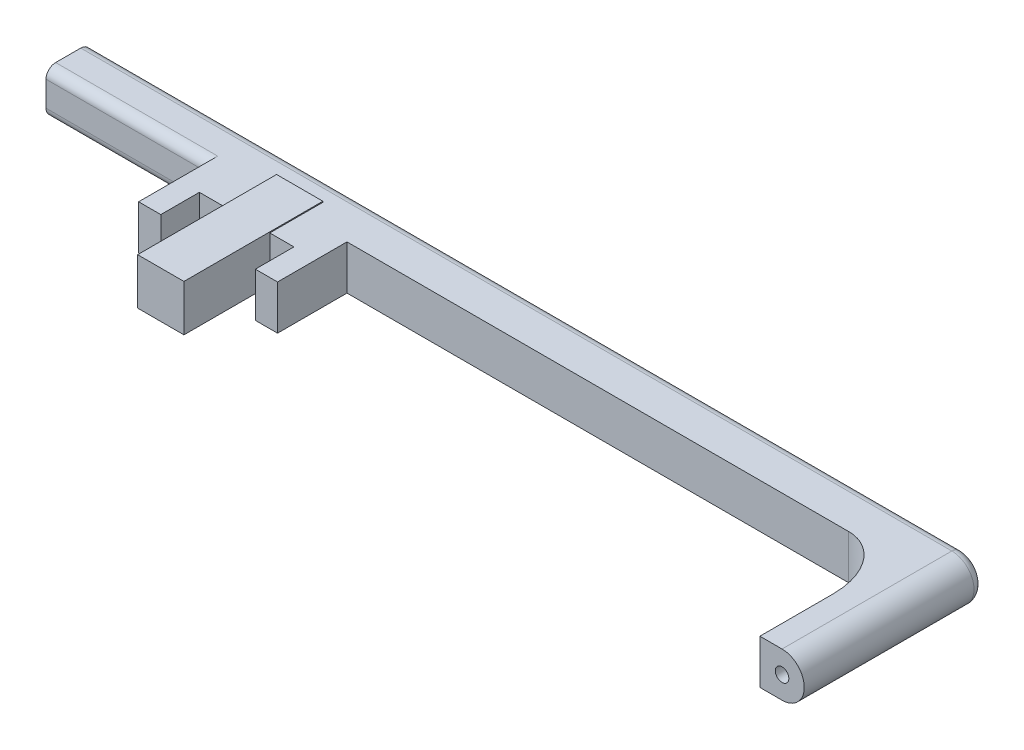
ISO-10303-21;
HEADER;
FILE_DESCRIPTION(('STEP AP214'),'2;1');
FILE_NAME('part.step','',(''),(''),'','','');
FILE_SCHEMA(('AUTOMOTIVE_DESIGN { 1 0 10303 214 1 1 1 1 }'));
ENDSEC;
DATA;
#1=APPLICATION_CONTEXT('core data for automotive mechanical design processes');
#2=APPLICATION_PROTOCOL_DEFINITION('international standard','automotive_design',2000,#1);
#3=PRODUCT_CONTEXT('',#1,'mechanical');
#4=PRODUCT('Part','Part','',(#3));
#5=PRODUCT_RELATED_PRODUCT_CATEGORY('part','',(#4));
#6=PRODUCT_DEFINITION_FORMATION('','',#4);
#7=PRODUCT_DEFINITION_CONTEXT('part definition',#1,'design');
#8=PRODUCT_DEFINITION('design','',#6,#7);
#9=PRODUCT_DEFINITION_SHAPE('','',#8);
#10=(LENGTH_UNIT() NAMED_UNIT(*) SI_UNIT(.MILLI.,.METRE.));
#11=(NAMED_UNIT(*) PLANE_ANGLE_UNIT() SI_UNIT($,.RADIAN.));
#12=(NAMED_UNIT(*) SI_UNIT($,.STERADIAN.) SOLID_ANGLE_UNIT());
#13=UNCERTAINTY_MEASURE_WITH_UNIT(LENGTH_MEASURE(1.E-05),#10,'distance_accuracy_value','');
#14=(GEOMETRIC_REPRESENTATION_CONTEXT(3) GLOBAL_UNCERTAINTY_ASSIGNED_CONTEXT((#13)) GLOBAL_UNIT_ASSIGNED_CONTEXT((#10,
#11,#12)) REPRESENTATION_CONTEXT('',''));
#15=CARTESIAN_POINT('',(0.,0.,0.));
#16=DIRECTION('',(0.,0.,1.));
#17=DIRECTION('',(1.,0.,0.));
#18=AXIS2_PLACEMENT_3D('',#15,#16,#17);
#19=CARTESIAN_POINT('',(1.2,-1.2,7.2));
#20=DIRECTION('',(-1.,0.,0.));
#21=DIRECTION('',(0.,0.,1.));
#22=AXIS2_PLACEMENT_3D('',#19,#20,#21);
#23=PLANE('',#22);
#24=DIRECTION('',(0.,-1.,0.));
#25=VECTOR('',#24,1.);
#26=CARTESIAN_POINT('',(1.2,-1.2,2.75));
#27=LINE('',#26,#25);
#28=CARTESIAN_POINT('',(1.2,1.15,2.75));
#29=VERTEX_POINT('',#28);
#30=CARTESIAN_POINT('',(1.2,-1.15,2.75));
#31=VERTEX_POINT('',#30);
#32=EDGE_CURVE('E527',#29,#31,#27,.T.);
#33=ORIENTED_EDGE('',*,*,#32,.F.);
#34=DIRECTION('',(0.,0.,-1.));
#35=VECTOR('',#34,1.);
#36=CARTESIAN_POINT('',(1.2,1.15,7.2));
#37=LINE('',#36,#35);
#38=CARTESIAN_POINT('',(1.2,1.15,0.));
#39=VERTEX_POINT('',#38);
#40=EDGE_CURVE('E249',#29,#39,#37,.T.);
#41=ORIENTED_EDGE('',*,*,#40,.T.);
#42=DIRECTION('',(0.,1.,0.));
#43=VECTOR('',#42,1.);
#44=CARTESIAN_POINT('',(1.2,-1.2,0.));
#45=LINE('',#44,#43);
#46=CARTESIAN_POINT('',(1.2,1.2,0.));
#47=VERTEX_POINT('',#46);
#48=EDGE_CURVE('E502',#39,#47,#45,.T.);
#49=ORIENTED_EDGE('',*,*,#48,.T.);
#50=DIRECTION('',(0.,0.,-1.));
#51=VECTOR('',#50,1.);
#52=CARTESIAN_POINT('',(1.2,1.2,7.2));
#53=LINE('',#52,#51);
#54=CARTESIAN_POINT('',(1.2,1.2,7.2));
#55=VERTEX_POINT('',#54);
#56=EDGE_CURVE('E477',#55,#47,#53,.T.);
#57=ORIENTED_EDGE('',*,*,#56,.F.);
#58=DIRECTION('',(0.,1.,0.));
#59=VECTOR('',#58,1.);
#60=CARTESIAN_POINT('',(1.2,-1.2,7.2));
#61=LINE('',#60,#59);
#62=CARTESIAN_POINT('',(1.2,-1.2,7.2));
#63=VERTEX_POINT('',#62);
#64=EDGE_CURVE('E493',#63,#55,#61,.T.);
#65=ORIENTED_EDGE('',*,*,#64,.F.);
#66=DIRECTION('',(0.,0.,-1.));
#67=VECTOR('',#66,1.);
#68=CARTESIAN_POINT('',(1.2,-1.2,7.2));
#69=LINE('',#68,#67);
#70=CARTESIAN_POINT('',(1.2,-1.2,0.));
#71=VERTEX_POINT('',#70);
#72=EDGE_CURVE('E487',#63,#71,#69,.T.);
#73=ORIENTED_EDGE('',*,*,#72,.T.);
#74=CARTESIAN_POINT('',(1.2,-1.15,0.));
#75=VERTEX_POINT('',#74);
#76=EDGE_CURVE('E499',#71,#75,#45,.T.);
#77=ORIENTED_EDGE('',*,*,#76,.T.);
#78=DIRECTION('',(0.,0.,1.));
#79=VECTOR('',#78,1.);
#80=CARTESIAN_POINT('',(1.2,-1.15,7.2));
#81=LINE('',#80,#79);
#82=EDGE_CURVE('E510',#75,#31,#81,.T.);
#83=ORIENTED_EDGE('',*,*,#82,.T.);
#84=EDGE_LOOP('',(#33,#41,#49,#57,#65,#73,#77,#83));
#85=FACE_BOUND('',#84,.T.);
#86=ADVANCED_FACE('F43',(#85),#23,.F.);
#87=CARTESIAN_POINT('',(-1.2,-1.2,7.2));
#88=DIRECTION('',(1.,0.,0.));
#89=DIRECTION('',(0.,0.,-1.));
#90=AXIS2_PLACEMENT_3D('',#87,#88,#89);
#91=PLANE('',#90);
#92=DIRECTION('',(0.,0.,1.));
#93=VECTOR('',#92,1.);
#94=CARTESIAN_POINT('',(-1.2,1.15,7.2));
#95=LINE('',#94,#93);
#96=CARTESIAN_POINT('',(-1.2,1.15,0.));
#97=VERTEX_POINT('',#96);
#98=CARTESIAN_POINT('',(-1.2,1.15,2.75));
#99=VERTEX_POINT('',#98);
#100=EDGE_CURVE('E61',#97,#99,#95,.T.);
#101=ORIENTED_EDGE('',*,*,#100,.T.);
#102=DIRECTION('',(0.,1.,0.));
#103=VECTOR('',#102,1.);
#104=CARTESIAN_POINT('',(-1.2,-1.2,2.75));
#105=LINE('',#104,#103);
#106=CARTESIAN_POINT('',(-1.2,-1.15,2.75));
#107=VERTEX_POINT('',#106);
#108=EDGE_CURVE('E529',#107,#99,#105,.T.);
#109=ORIENTED_EDGE('',*,*,#108,.F.);
#110=DIRECTION('',(0.,0.,-1.));
#111=VECTOR('',#110,1.);
#112=CARTESIAN_POINT('',(-1.2,-1.15,7.2));
#113=LINE('',#112,#111);
#114=CARTESIAN_POINT('',(-1.2,-1.15,0.));
#115=VERTEX_POINT('',#114);
#116=EDGE_CURVE('E69',#107,#115,#113,.T.);
#117=ORIENTED_EDGE('',*,*,#116,.T.);
#118=DIRECTION('',(0.,-1.,0.));
#119=VECTOR('',#118,1.);
#120=CARTESIAN_POINT('',(-1.2,-1.2,0.));
#121=LINE('',#120,#119);
#122=CARTESIAN_POINT('',(-1.2,-1.2,0.));
#123=VERTEX_POINT('',#122);
#124=EDGE_CURVE('E496',#115,#123,#121,.T.);
#125=ORIENTED_EDGE('',*,*,#124,.T.);
#126=DIRECTION('',(0.,0.,-1.));
#127=VECTOR('',#126,1.);
#128=CARTESIAN_POINT('',(-1.2,-1.2,7.2));
#129=LINE('',#128,#127);
#130=CARTESIAN_POINT('',(-1.2,-1.2,7.2));
#131=VERTEX_POINT('',#130);
#132=EDGE_CURVE('E484',#131,#123,#129,.T.);
#133=ORIENTED_EDGE('',*,*,#132,.F.);
#134=DIRECTION('',(0.,-1.,0.));
#135=VECTOR('',#134,1.);
#136=CARTESIAN_POINT('',(-1.2,-1.2,7.2));
#137=LINE('',#136,#135);
#138=CARTESIAN_POINT('',(-1.2,1.2,7.2));
#139=VERTEX_POINT('',#138);
#140=EDGE_CURVE('E504',#139,#131,#137,.T.);
#141=ORIENTED_EDGE('',*,*,#140,.F.);
#142=DIRECTION('',(0.,0.,-1.));
#143=VECTOR('',#142,1.);
#144=CARTESIAN_POINT('',(-1.2,1.2,7.2));
#145=LINE('',#144,#143);
#146=CARTESIAN_POINT('',(-1.2,1.2,0.));
#147=VERTEX_POINT('',#146);
#148=EDGE_CURVE('E479',#139,#147,#145,.T.);
#149=ORIENTED_EDGE('',*,*,#148,.T.);
#150=EDGE_CURVE('E494',#147,#97,#121,.T.);
#151=ORIENTED_EDGE('',*,*,#150,.T.);
#152=EDGE_LOOP('',(#101,#109,#117,#125,#133,#141,#149,#151));
#153=FACE_BOUND('',#152,.T.);
#154=ADVANCED_FACE('F605',(#153),#91,.F.);
#155=CARTESIAN_POINT('',(-2.45,0.,-0.65));
#156=DIRECTION('',(-1.,0.,0.));
#157=DIRECTION('',(0.,-1.,0.));
#158=AXIS2_PLACEMENT_3D('',#155,#156,#157);
#159=PLANE('',#158);
#160=DIRECTION('',(0.,-1.,0.));
#161=VECTOR('',#160,1.);
#162=CARTESIAN_POINT('',(-2.45,0.,2.75));
#163=LINE('',#162,#161);
#164=CARTESIAN_POINT('',(-2.45,1.15,2.75));
#165=VERTEX_POINT('',#164);
#166=CARTESIAN_POINT('',(-2.45,-1.15,2.75));
#167=VERTEX_POINT('',#166);
#168=EDGE_CURVE('E238',#165,#167,#163,.T.);
#169=ORIENTED_EDGE('',*,*,#168,.F.);
#170=DIRECTION('',(0.,0.,1.));
#171=VECTOR('',#170,1.);
#172=CARTESIAN_POINT('',(-2.45,1.15,-0.65));
#173=LINE('',#172,#171);
#174=CARTESIAN_POINT('',(-2.45,1.15,4.75));
#175=VERTEX_POINT('',#174);
#176=EDGE_CURVE('E284',#165,#175,#173,.T.);
#177=ORIENTED_EDGE('',*,*,#176,.T.);
#178=DIRECTION('',(0.,-1.,0.));
#179=VECTOR('',#178,1.);
#180=CARTESIAN_POINT('',(-2.45,0.,4.75));
#181=LINE('',#180,#179);
#182=CARTESIAN_POINT('',(-2.45,-1.15,4.75));
#183=VERTEX_POINT('',#182);
#184=EDGE_CURVE('E280',#175,#183,#181,.T.);
#185=ORIENTED_EDGE('',*,*,#184,.T.);
#186=DIRECTION('',(0.,0.,1.));
#187=VECTOR('',#186,1.);
#188=CARTESIAN_POINT('',(-2.45,-1.15,-0.65));
#189=LINE('',#188,#187);
#190=EDGE_CURVE('E287',#167,#183,#189,.T.);
#191=ORIENTED_EDGE('',*,*,#190,.F.);
#192=EDGE_LOOP('',(#169,#177,#185,#191));
#193=FACE_BOUND('',#192,.T.);
#194=ADVANCED_FACE('F541',(#193),#159,.F.);
#195=CARTESIAN_POINT('',(2.45,0.,4.75));
#196=DIRECTION('',(-1.,0.,0.));
#197=DIRECTION('',(0.,0.,1.));
#198=AXIS2_PLACEMENT_3D('',#195,#196,#197);
#199=PLANE('',#198);
#200=DIRECTION('',(0.,0.,-1.));
#201=VECTOR('',#200,1.);
#202=CARTESIAN_POINT('',(2.45,1.15,4.75));
#203=LINE('',#202,#201);
#204=CARTESIAN_POINT('',(2.45,1.15,4.75));
#205=VERTEX_POINT('',#204);
#206=CARTESIAN_POINT('',(2.45,1.15,2.75));
#207=VERTEX_POINT('',#206);
#208=EDGE_CURVE('E245',#205,#207,#203,.T.);
#209=ORIENTED_EDGE('',*,*,#208,.T.);
#210=DIRECTION('',(0.,-1.,0.));
#211=VECTOR('',#210,1.);
#212=CARTESIAN_POINT('',(2.45,0.,2.75));
#213=LINE('',#212,#211);
#214=CARTESIAN_POINT('',(2.45,-1.15,2.75));
#215=VERTEX_POINT('',#214);
#216=EDGE_CURVE('E227',#207,#215,#213,.T.);
#217=ORIENTED_EDGE('',*,*,#216,.T.);
#218=DIRECTION('',(0.,0.,-1.));
#219=VECTOR('',#218,1.);
#220=CARTESIAN_POINT('',(2.45,-1.15,4.75));
#221=LINE('',#220,#219);
#222=CARTESIAN_POINT('',(2.45,-1.15,4.75));
#223=VERTEX_POINT('',#222);
#224=EDGE_CURVE('E266',#223,#215,#221,.T.);
#225=ORIENTED_EDGE('',*,*,#224,.F.);
#226=DIRECTION('',(0.,1.,0.));
#227=VECTOR('',#226,1.);
#228=CARTESIAN_POINT('',(2.45,0.,4.75));
#229=LINE('',#228,#227);
#230=EDGE_CURVE('E254',#223,#205,#229,.T.);
#231=ORIENTED_EDGE('',*,*,#230,.T.);
#232=EDGE_LOOP('',(#209,#217,#225,#231));
#233=FACE_BOUND('',#232,.T.);
#234=ADVANCED_FACE('F252',(#233),#199,.T.);
#235=CARTESIAN_POINT('',(0.,0.,0.));
#236=DIRECTION('',(0.,0.,-1.));
#237=DIRECTION('',(-1.,0.,0.));
#238=AXIS2_PLACEMENT_3D('',#235,#236,#237);
#239=PLANE('',#238);
#240=DIRECTION('',(-1.,0.,0.));
#241=VECTOR('',#240,1.);
#242=CARTESIAN_POINT('',(0.,-1.15,0.));
#243=LINE('',#242,#241);
#244=EDGE_CURVE('E330',#75,#115,#243,.T.);
#245=ORIENTED_EDGE('',*,*,#244,.F.);
#246=ORIENTED_EDGE('',*,*,#76,.F.);
#247=DIRECTION('',(1.,0.,0.));
#248=VECTOR('',#247,1.);
#249=CARTESIAN_POINT('',(-1.2,-1.2,0.));
#250=LINE('',#249,#248);
#251=EDGE_CURVE('E491',#123,#71,#250,.T.);
#252=ORIENTED_EDGE('',*,*,#251,.F.);
#253=ORIENTED_EDGE('',*,*,#124,.F.);
#254=EDGE_LOOP('',(#245,#246,#252,#253));
#255=FACE_BOUND('',#254,.T.);
#256=ADVANCED_FACE('F615',(#255),#239,.T.);
#257=CARTESIAN_POINT('',(-1.2,1.2,7.2));
#258=DIRECTION('',(0.,-1.,0.));
#259=DIRECTION('',(0.,0.,-1.));
#260=AXIS2_PLACEMENT_3D('',#257,#258,#259);
#261=PLANE('',#260);
#262=DIRECTION('',(-1.,0.,0.));
#263=VECTOR('',#262,1.);
#264=CARTESIAN_POINT('',(-1.2,1.2,0.));
#265=LINE('',#264,#263);
#266=EDGE_CURVE('E497',#47,#147,#265,.T.);
#267=ORIENTED_EDGE('',*,*,#266,.T.);
#268=ORIENTED_EDGE('',*,*,#148,.F.);
#269=DIRECTION('',(-1.,0.,0.));
#270=VECTOR('',#269,1.);
#271=CARTESIAN_POINT('',(-1.2,1.2,7.2));
#272=LINE('',#271,#270);
#273=EDGE_CURVE('E506',#55,#139,#272,.T.);
#274=ORIENTED_EDGE('',*,*,#273,.F.);
#275=ORIENTED_EDGE('',*,*,#56,.T.);
#276=EDGE_LOOP('',(#267,#268,#274,#275));
#277=FACE_BOUND('',#276,.T.);
#278=ADVANCED_FACE('F631',(#277),#261,.F.);
#279=CARTESIAN_POINT('',(-1.2,-1.2,7.2));
#280=DIRECTION('',(0.,1.,0.));
#281=DIRECTION('',(0.,0.,1.));
#282=AXIS2_PLACEMENT_3D('',#279,#280,#281);
#283=PLANE('',#282);
#284=ORIENTED_EDGE('',*,*,#251,.T.);
#285=ORIENTED_EDGE('',*,*,#72,.F.);
#286=DIRECTION('',(1.,0.,0.));
#287=VECTOR('',#286,1.);
#288=CARTESIAN_POINT('',(-1.2,-1.2,7.2));
#289=LINE('',#288,#287);
#290=EDGE_CURVE('E490',#131,#63,#289,.T.);
#291=ORIENTED_EDGE('',*,*,#290,.F.);
#292=ORIENTED_EDGE('',*,*,#132,.T.);
#293=EDGE_LOOP('',(#284,#285,#291,#292));
#294=FACE_BOUND('',#293,.T.);
#295=ADVANCED_FACE('F621',(#294),#283,.F.);
#296=CARTESIAN_POINT('',(0.,0.,7.2));
#297=DIRECTION('',(0.,0.,-1.));
#298=DIRECTION('',(-1.,0.,0.));
#299=AXIS2_PLACEMENT_3D('',#296,#297,#298);
#300=PLANE('',#299);
#301=ORIENTED_EDGE('',*,*,#64,.T.);
#302=ORIENTED_EDGE('',*,*,#273,.T.);
#303=ORIENTED_EDGE('',*,*,#140,.T.);
#304=ORIENTED_EDGE('',*,*,#290,.T.);
#305=EDGE_LOOP('',(#301,#302,#303,#304));
#306=FACE_BOUND('',#305,.T.);
#307=ADVANCED_FACE('F623',(#306),#300,.F.);
#308=DIRECTION('',(1.,0.,0.));
#309=VECTOR('',#308,1.);
#310=CARTESIAN_POINT('',(0.,1.15,0.));
#311=LINE('',#310,#309);
#312=EDGE_CURVE('E475',#97,#39,#311,.T.);
#313=ORIENTED_EDGE('',*,*,#312,.F.);
#314=ORIENTED_EDGE('',*,*,#150,.F.);
#315=ORIENTED_EDGE('',*,*,#266,.F.);
#316=ORIENTED_EDGE('',*,*,#48,.F.);
#317=EDGE_LOOP('',(#313,#314,#315,#316));
#318=FACE_BOUND('',#317,.T.);
#319=ADVANCED_FACE('F630',(#318),#239,.T.);
#320=CARTESIAN_POINT('',(-12.,-1.15,1.15));
#321=DIRECTION('',(0.,0.,1.));
#322=DIRECTION('',(1.,0.,0.));
#323=AXIS2_PLACEMENT_3D('',#320,#321,#322);
#324=PLANE('',#323);
#325=DIRECTION('',(0.,1.,0.));
#326=VECTOR('',#325,1.);
#327=CARTESIAN_POINT('',(3.6,-1.15,1.15));
#328=LINE('',#327,#326);
#329=CARTESIAN_POINT('',(3.6,-1.15,1.15));
#330=VERTEX_POINT('',#329);
#331=CARTESIAN_POINT('',(3.6,1.15,1.15));
#332=VERTEX_POINT('',#331);
#333=EDGE_CURVE('E268',#330,#332,#328,.T.);
#334=ORIENTED_EDGE('',*,*,#333,.F.);
#335=DIRECTION('',(1.,0.,0.));
#336=VECTOR('',#335,1.);
#337=CARTESIAN_POINT('',(-12.,-1.15,1.15));
#338=LINE('',#337,#336);
#339=CARTESIAN_POINT('',(29.6,-1.15,1.15));
#340=VERTEX_POINT('',#339);
#341=EDGE_CURVE('E47',#330,#340,#338,.T.);
#342=ORIENTED_EDGE('',*,*,#341,.T.);
#343=CARTESIAN_POINT('',(29.6,1.265,1.15));
#344=CARTESIAN_POINT('',(29.6,0.421666666666668,1.15));
#345=CARTESIAN_POINT('',(29.6,-0.421666666666668,1.15));
#346=CARTESIAN_POINT('',(29.6,-1.265,1.15));
#347=(BOUNDED_CURVE() B_SPLINE_CURVE(3,(#343,#344,#345,#346),.UNSPECIFIED.,.F.,
.F.) B_SPLINE_CURVE_WITH_KNOTS((4,4),(-0.001265,0.001265),
.UNSPECIFIED.) CURVE() GEOMETRIC_REPRESENTATION_ITEM() RATIONAL_B_SPLINE_CURVE((1.,1.,1.,1.)) REPRESENTATION_ITEM(''));
#348=CARTESIAN_POINT('',(29.6,1.15,1.15));
#349=VERTEX_POINT('',#348);
#350=EDGE_CURVE('E462',#340,#349,#347,.F.);
#351=ORIENTED_EDGE('',*,*,#350,.T.);
#352=DIRECTION('',(1.,0.,0.));
#353=VECTOR('',#352,1.);
#354=CARTESIAN_POINT('',(-12.,1.15,1.15));
#355=LINE('',#354,#353);
#356=EDGE_CURVE('E352',#332,#349,#355,.T.);
#357=ORIENTED_EDGE('',*,*,#356,.F.);
#358=EDGE_LOOP('',(#334,#342,#351,#357));
#359=FACE_BOUND('',#358,.T.);
#360=ADVANCED_FACE('F514',(#359),#324,.T.);
#361=DIRECTION('',(0.,-1.,0.));
#362=VECTOR('',#361,1.);
#363=CARTESIAN_POINT('',(-3.6,-1.15,1.15));
#364=LINE('',#363,#362);
#365=CARTESIAN_POINT('',(-3.6,0.65,1.15));
#366=VERTEX_POINT('',#365);
#367=CARTESIAN_POINT('',(-3.6,-0.65,1.15));
#368=VERTEX_POINT('',#367);
#369=EDGE_CURVE('E286',#366,#368,#364,.T.);
#370=ORIENTED_EDGE('',*,*,#369,.F.);
#371=DIRECTION('',(1.,0.,0.));
#372=VECTOR('',#371,1.);
#373=CARTESIAN_POINT('',(-12.,0.65,1.15));
#374=LINE('',#373,#372);
#375=CARTESIAN_POINT('',(-12.,0.65,1.15));
#376=VERTEX_POINT('',#375);
#377=EDGE_CURVE('E370',#366,#376,#374,.F.);
#378=ORIENTED_EDGE('',*,*,#377,.T.);
#379=DIRECTION('',(0.,-1.,0.));
#380=VECTOR('',#379,1.);
#381=CARTESIAN_POINT('',(-12.,-1.15,1.15));
#382=LINE('',#381,#380);
#383=CARTESIAN_POINT('',(-12.,-0.65,1.15));
#384=VERTEX_POINT('',#383);
#385=EDGE_CURVE('E347',#376,#384,#382,.T.);
#386=ORIENTED_EDGE('',*,*,#385,.T.);
#387=DIRECTION('',(1.,0.,0.));
#388=VECTOR('',#387,1.);
#389=CARTESIAN_POINT('',(-12.,-0.65,1.15));
#390=LINE('',#389,#388);
#391=EDGE_CURVE('E367',#384,#368,#390,.T.);
#392=ORIENTED_EDGE('',*,*,#391,.T.);
#393=EDGE_LOOP('',(#370,#378,#386,#392));
#394=FACE_BOUND('',#393,.T.);
#395=ADVANCED_FACE('F563',(#394),#324,.T.);
#396=CARTESIAN_POINT('',(-12.,-1.15,1.15));
#397=DIRECTION('',(0.,-1.,0.));
#398=DIRECTION('',(0.,0.,-1.));
#399=AXIS2_PLACEMENT_3D('',#396,#397,#398);
#400=PLANE('',#399);
#401=DIRECTION('',(1.,0.,0.));
#402=VECTOR('',#401,1.);
#403=CARTESIAN_POINT('',(-12.,-1.15,-0.65));
#404=LINE('',#403,#402);
#405=CARTESIAN_POINT('',(-12.,-1.15,-0.65));
#406=VERTEX_POINT('',#405);
#407=CARTESIAN_POINT('',(33.15,-1.15,-0.65));
#408=VERTEX_POINT('',#407);
#409=EDGE_CURVE('E388',#406,#408,#404,.T.);
#410=ORIENTED_EDGE('',*,*,#409,.T.);
#411=DIRECTION('',(0.,0.,-1.));
#412=VECTOR('',#411,1.);
#413=CARTESIAN_POINT('',(33.15,-1.15,8.15));
#414=LINE('',#413,#412);
#415=CARTESIAN_POINT('',(33.15,-1.15,8.15));
#416=VERTEX_POINT('',#415);
#417=EDGE_CURVE('E337',#416,#408,#414,.T.);
#418=ORIENTED_EDGE('',*,*,#417,.F.);
#419=DIRECTION('',(1.,0.,0.));
#420=VECTOR('',#419,1.);
#421=CARTESIAN_POINT('',(32.,-1.15,8.15));
#422=LINE('',#421,#420);
#423=CARTESIAN_POINT('',(32.,-1.15,8.15));
#424=VERTEX_POINT('',#423);
#425=EDGE_CURVE('E314',#424,#416,#422,.T.);
#426=ORIENTED_EDGE('',*,*,#425,.F.);
#427=DIRECTION('',(0.,0.,-1.));
#428=VECTOR('',#427,1.);
#429=CARTESIAN_POINT('',(32.,-1.15,8.15));
#430=LINE('',#429,#428);
#431=CARTESIAN_POINT('',(32.,-1.15,4.35));
#432=VERTEX_POINT('',#431);
#433=EDGE_CURVE('E332',#424,#432,#430,.T.);
#434=ORIENTED_EDGE('',*,*,#433,.T.);
#435=CARTESIAN_POINT('',(29.6,-1.15,1.15));
#436=CARTESIAN_POINT('',(32.,-1.15,1.15));
#437=CARTESIAN_POINT('',(32.,-1.15,4.35));
#438=(BOUNDED_CURVE() B_SPLINE_CURVE(2,(#435,#436,#437),.UNSPECIFIED.,.F.,
.F.) B_SPLINE_CURVE_WITH_KNOTS((3,3),(0.,1.),
.UNSPECIFIED.) CURVE() GEOMETRIC_REPRESENTATION_ITEM() RATIONAL_B_SPLINE_CURVE((1.,
0.707106781186548,1.)) REPRESENTATION_ITEM(''));
#439=EDGE_CURVE('E466',#432,#340,#438,.F.);
#440=ORIENTED_EDGE('',*,*,#439,.T.);
#441=ORIENTED_EDGE('',*,*,#341,.F.);
#442=DIRECTION('',(0.,0.,-1.));
#443=VECTOR('',#442,1.);
#444=CARTESIAN_POINT('',(3.6,-1.15,4.75));
#445=LINE('',#444,#443);
#446=CARTESIAN_POINT('',(3.6,-1.15,4.75));
#447=VERTEX_POINT('',#446);
#448=EDGE_CURVE('E259',#447,#330,#445,.T.);
#449=ORIENTED_EDGE('',*,*,#448,.F.);
#450=DIRECTION('',(1.,0.,0.));
#451=VECTOR('',#450,1.);
#452=CARTESIAN_POINT('',(0.,-1.15,4.75));
#453=LINE('',#452,#451);
#454=EDGE_CURVE('E519',#223,#447,#453,.T.);
#455=ORIENTED_EDGE('',*,*,#454,.F.);
#456=ORIENTED_EDGE('',*,*,#224,.T.);
#457=DIRECTION('',(1.,0.,0.));
#458=VECTOR('',#457,1.);
#459=CARTESIAN_POINT('',(-3.6,-1.15,2.75));
#460=LINE('',#459,#458);
#461=EDGE_CURVE('E234',#31,#215,#460,.T.);
#462=ORIENTED_EDGE('',*,*,#461,.F.);
#463=ORIENTED_EDGE('',*,*,#82,.F.);
#464=ORIENTED_EDGE('',*,*,#244,.T.);
#465=ORIENTED_EDGE('',*,*,#116,.F.);
#466=EDGE_CURVE('E239',#167,#107,#460,.T.);
#467=ORIENTED_EDGE('',*,*,#466,.F.);
#468=ORIENTED_EDGE('',*,*,#190,.T.);
#469=DIRECTION('',(1.,0.,0.));
#470=VECTOR('',#469,1.);
#471=CARTESIAN_POINT('',(0.,-1.15,4.75));
#472=LINE('',#471,#470);
#473=CARTESIAN_POINT('',(-3.6,-1.15,4.75));
#474=VERTEX_POINT('',#473);
#475=EDGE_CURVE('E277',#474,#183,#472,.T.);
#476=ORIENTED_EDGE('',*,*,#475,.F.);
#477=DIRECTION('',(0.,0.,1.));
#478=VECTOR('',#477,1.);
#479=CARTESIAN_POINT('',(-3.6,-1.15,-0.65));
#480=LINE('',#479,#478);
#481=CARTESIAN_POINT('',(-3.6,-1.15,0.65));
#482=VERTEX_POINT('',#481);
#483=EDGE_CURVE('E289',#482,#474,#480,.T.);
#484=ORIENTED_EDGE('',*,*,#483,.F.);
#485=DIRECTION('',(1.,0.,0.));
#486=VECTOR('',#485,1.);
#487=CARTESIAN_POINT('',(-12.,-1.15,0.65));
#488=LINE('',#487,#486);
#489=CARTESIAN_POINT('',(-12.,-1.15,0.65));
#490=VERTEX_POINT('',#489);
#491=EDGE_CURVE('E390',#482,#490,#488,.F.);
#492=ORIENTED_EDGE('',*,*,#491,.T.);
#493=DIRECTION('',(0.,0.,-1.));
#494=VECTOR('',#493,1.);
#495=CARTESIAN_POINT('',(-12.,-1.15,1.15));
#496=LINE('',#495,#494);
#497=EDGE_CURVE('E350',#490,#406,#496,.T.);
#498=ORIENTED_EDGE('',*,*,#497,.T.);
#499=EDGE_LOOP('',(#410,#418,#426,#434,#440,#441,#449,#455,#456,#462,#463,#464,#465,#467,#468,
#476,#484,#492,#498));
#500=FACE_BOUND('',#499,.T.);
#501=ADVANCED_FACE('F516',(#500),#400,.T.);
#502=CARTESIAN_POINT('',(-12.,1.15,1.15));
#503=DIRECTION('',(0.,1.,0.));
#504=DIRECTION('',(0.,0.,1.));
#505=AXIS2_PLACEMENT_3D('',#502,#503,#504);
#506=PLANE('',#505);
#507=DIRECTION('',(-1.,0.,0.));
#508=VECTOR('',#507,1.);
#509=CARTESIAN_POINT('',(-3.6,1.15,2.75));
#510=LINE('',#509,#508);
#511=EDGE_CURVE('E250',#99,#165,#510,.T.);
#512=ORIENTED_EDGE('',*,*,#511,.F.);
#513=ORIENTED_EDGE('',*,*,#100,.F.);
#514=ORIENTED_EDGE('',*,*,#312,.T.);
#515=ORIENTED_EDGE('',*,*,#40,.F.);
#516=EDGE_CURVE('E231',#207,#29,#510,.T.);
#517=ORIENTED_EDGE('',*,*,#516,.F.);
#518=ORIENTED_EDGE('',*,*,#208,.F.);
#519=DIRECTION('',(1.,0.,0.));
#520=VECTOR('',#519,1.);
#521=CARTESIAN_POINT('',(0.,1.15,4.75));
#522=LINE('',#521,#520);
#523=CARTESIAN_POINT('',(3.6,1.15,4.75));
#524=VERTEX_POINT('',#523);
#525=EDGE_CURVE('E257',#205,#524,#522,.T.);
#526=ORIENTED_EDGE('',*,*,#525,.T.);
#527=DIRECTION('',(0.,0.,-1.));
#528=VECTOR('',#527,1.);
#529=CARTESIAN_POINT('',(3.6,1.15,4.75));
#530=LINE('',#529,#528);
#531=EDGE_CURVE('E256',#524,#332,#530,.T.);
#532=ORIENTED_EDGE('',*,*,#531,.T.);
#533=ORIENTED_EDGE('',*,*,#356,.T.);
#534=CARTESIAN_POINT('',(32.,1.15,4.35));
#535=CARTESIAN_POINT('',(32.,1.15,1.15));
#536=CARTESIAN_POINT('',(29.6,1.15,1.15));
#537=(BOUNDED_CURVE() B_SPLINE_CURVE(2,(#534,#535,#536),.UNSPECIFIED.,.F.,
.F.) B_SPLINE_CURVE_WITH_KNOTS((3,3),(0.,1.),
.UNSPECIFIED.) CURVE() GEOMETRIC_REPRESENTATION_ITEM() RATIONAL_B_SPLINE_CURVE((1.,
0.707106781186548,1.)) REPRESENTATION_ITEM(''));
#538=CARTESIAN_POINT('',(32.,1.15,4.35));
#539=VERTEX_POINT('',#538);
#540=EDGE_CURVE('E392',#349,#539,#537,.F.);
#541=ORIENTED_EDGE('',*,*,#540,.T.);
#542=DIRECTION('',(0.,0.,-1.));
#543=VECTOR('',#542,1.);
#544=CARTESIAN_POINT('',(32.,1.15,8.15));
#545=LINE('',#544,#543);
#546=CARTESIAN_POINT('',(32.,1.15,8.15));
#547=VERTEX_POINT('',#546);
#548=EDGE_CURVE('E321',#547,#539,#545,.T.);
#549=ORIENTED_EDGE('',*,*,#548,.F.);
#550=DIRECTION('',(-1.,0.,0.));
#551=VECTOR('',#550,1.);
#552=CARTESIAN_POINT('',(32.,1.15,8.15));
#553=LINE('',#552,#551);
#554=CARTESIAN_POINT('',(33.15,1.15,8.15));
#555=VERTEX_POINT('',#554);
#556=EDGE_CURVE('E318',#555,#547,#553,.T.);
#557=ORIENTED_EDGE('',*,*,#556,.F.);
#558=DIRECTION('',(0.,0.,-1.));
#559=VECTOR('',#558,1.);
#560=CARTESIAN_POINT('',(33.15,1.15,8.15));
#561=LINE('',#560,#559);
#562=CARTESIAN_POINT('',(33.15,1.15,-0.65));
#563=VERTEX_POINT('',#562);
#564=EDGE_CURVE('E324',#555,#563,#561,.T.);
#565=ORIENTED_EDGE('',*,*,#564,.T.);
#566=DIRECTION('',(1.,0.,0.));
#567=VECTOR('',#566,1.);
#568=CARTESIAN_POINT('',(-12.,1.15,-0.65));
#569=LINE('',#568,#567);
#570=CARTESIAN_POINT('',(-12.,1.15,-0.65));
#571=VERTEX_POINT('',#570);
#572=EDGE_CURVE('E365',#563,#571,#569,.F.);
#573=ORIENTED_EDGE('',*,*,#572,.T.);
#574=DIRECTION('',(0.,0.,1.));
#575=VECTOR('',#574,1.);
#576=CARTESIAN_POINT('',(-12.,1.15,1.15));
#577=LINE('',#576,#575);
#578=CARTESIAN_POINT('',(-12.,1.15,0.65));
#579=VERTEX_POINT('',#578);
#580=EDGE_CURVE('E344',#571,#579,#577,.T.);
#581=ORIENTED_EDGE('',*,*,#580,.T.);
#582=DIRECTION('',(1.,0.,0.));
#583=VECTOR('',#582,1.);
#584=CARTESIAN_POINT('',(-12.,1.15,0.65));
#585=LINE('',#584,#583);
#586=CARTESIAN_POINT('',(-3.6,1.15,0.65));
#587=VERTEX_POINT('',#586);
#588=EDGE_CURVE('E53',#579,#587,#585,.T.);
#589=ORIENTED_EDGE('',*,*,#588,.T.);
#590=DIRECTION('',(0.,0.,1.));
#591=VECTOR('',#590,1.);
#592=CARTESIAN_POINT('',(-3.6,1.15,-0.65));
#593=LINE('',#592,#591);
#594=CARTESIAN_POINT('',(-3.6,1.15,4.75));
#595=VERTEX_POINT('',#594);
#596=EDGE_CURVE('E283',#587,#595,#593,.T.);
#597=ORIENTED_EDGE('',*,*,#596,.T.);
#598=DIRECTION('',(1.,0.,0.));
#599=VECTOR('',#598,1.);
#600=CARTESIAN_POINT('',(0.,1.15,4.75));
#601=LINE('',#600,#599);
#602=EDGE_CURVE('E271',#595,#175,#601,.T.);
#603=ORIENTED_EDGE('',*,*,#602,.T.);
#604=ORIENTED_EDGE('',*,*,#176,.F.);
#605=EDGE_LOOP('',(#512,#513,#514,#515,#517,#518,#526,#532,#533,#541,#549,#557,#565,#573,#581,
#589,#597,#603,#604));
#606=FACE_BOUND('',#605,.T.);
#607=ADVANCED_FACE('F243',(#606),#506,.T.);
#608=CARTESIAN_POINT('',(-12.,-1.15,-1.15));
#609=DIRECTION('',(0.,0.,-1.));
#610=DIRECTION('',(-1.,0.,0.));
#611=AXIS2_PLACEMENT_3D('',#608,#609,#610);
#612=PLANE('',#611);
#613=CARTESIAN_POINT('',(33.15,0.,-1.15));
#614=DIRECTION('',(0.,0.,-1.));
#615=DIRECTION('',(-1.,0.,0.));
#616=AXIS2_PLACEMENT_3D('',#613,#614,#615);
#617=CIRCLE('',#616,0.65);
#618=CARTESIAN_POINT('',(33.15,0.65,-1.15));
#619=VERTEX_POINT('',#618);
#620=CARTESIAN_POINT('',(33.15,-0.65,-1.15));
#621=VERTEX_POINT('',#620);
#622=EDGE_CURVE('E384',#619,#621,#617,.T.);
#623=ORIENTED_EDGE('',*,*,#622,.T.);
#624=DIRECTION('',(1.,0.,0.));
#625=VECTOR('',#624,1.);
#626=CARTESIAN_POINT('',(-12.,-0.65,-1.15));
#627=LINE('',#626,#625);
#628=CARTESIAN_POINT('',(-12.,-0.65,-1.15));
#629=VERTEX_POINT('',#628);
#630=EDGE_CURVE('E382',#621,#629,#627,.F.);
#631=ORIENTED_EDGE('',*,*,#630,.T.);
#632=DIRECTION('',(0.,1.,0.));
#633=VECTOR('',#632,1.);
#634=CARTESIAN_POINT('',(-12.,-1.15,-1.15));
#635=LINE('',#634,#633);
#636=CARTESIAN_POINT('',(-12.,0.65,-1.15));
#637=VERTEX_POINT('',#636);
#638=EDGE_CURVE('E336',#629,#637,#635,.T.);
#639=ORIENTED_EDGE('',*,*,#638,.T.);
#640=DIRECTION('',(1.,0.,0.));
#641=VECTOR('',#640,1.);
#642=CARTESIAN_POINT('',(-12.,0.65,-1.15));
#643=LINE('',#642,#641);
#644=EDGE_CURVE('E386',#637,#619,#643,.T.);
#645=ORIENTED_EDGE('',*,*,#644,.T.);
#646=EDGE_LOOP('',(#623,#631,#639,#645));
#647=FACE_BOUND('',#646,.T.);
#648=CARTESIAN_POINT('',(33.15,0.,-1.15));
#649=DIRECTION('',(0.,0.,-1.));
#650=DIRECTION('',(-1.,0.,0.));
#651=AXIS2_PLACEMENT_3D('',#648,#649,#650);
#652=CIRCLE('',#651,0.350000000000001);
#653=CARTESIAN_POINT('',(32.8,0.,-1.15));
#654=VERTEX_POINT('',#653);
#655=EDGE_CURVE('E304',#654,#654,#652,.F.);
#656=ORIENTED_EDGE('',*,*,#655,.T.);
#657=EDGE_LOOP('',(#656));
#658=FACE_BOUND('',#657,.T.);
#659=ADVANCED_FACE('F576',(#647,#658),#612,.T.);
#660=CARTESIAN_POINT('',(-12.,0.,0.));
#661=DIRECTION('',(-1.,0.,0.));
#662=DIRECTION('',(0.,0.,1.));
#663=AXIS2_PLACEMENT_3D('',#660,#661,#662);
#664=PLANE('',#663);
#665=CARTESIAN_POINT('',(-12.,0.,0.));
#666=DIRECTION('',(-1.,0.,0.));
#667=DIRECTION('',(0.,0.,1.));
#668=AXIS2_PLACEMENT_3D('',#665,#666,#667);
#669=CIRCLE('',#668,0.35);
#670=CARTESIAN_POINT('',(-12.,0.,0.35));
#671=VERTEX_POINT('',#670);
#672=EDGE_CURVE('E301',#671,#671,#669,.T.);
#673=ORIENTED_EDGE('',*,*,#672,.F.);
#674=EDGE_LOOP('',(#673));
#675=FACE_BOUND('',#674,.T.);
#676=ORIENTED_EDGE('',*,*,#638,.F.);
#677=CARTESIAN_POINT('',(-12.,-0.65,-0.65));
#678=DIRECTION('',(-1.,0.,0.));
#679=DIRECTION('',(0.,0.,1.));
#680=AXIS2_PLACEMENT_3D('',#677,#678,#679);
#681=CIRCLE('',#680,0.5);
#682=EDGE_CURVE('E374',#629,#406,#681,.T.);
#683=ORIENTED_EDGE('',*,*,#682,.T.);
#684=ORIENTED_EDGE('',*,*,#497,.F.);
#685=CARTESIAN_POINT('',(-12.,-0.65,0.65));
#686=DIRECTION('',(-1.,0.,0.));
#687=DIRECTION('',(0.,0.,1.));
#688=AXIS2_PLACEMENT_3D('',#685,#686,#687);
#689=CIRCLE('',#688,0.5);
#690=EDGE_CURVE('E376',#490,#384,#689,.T.);
#691=ORIENTED_EDGE('',*,*,#690,.T.);
#692=ORIENTED_EDGE('',*,*,#385,.F.);
#693=CARTESIAN_POINT('',(-12.,0.65,0.65));
#694=DIRECTION('',(-1.,0.,0.));
#695=DIRECTION('',(0.,0.,1.));
#696=AXIS2_PLACEMENT_3D('',#693,#694,#695);
#697=CIRCLE('',#696,0.5);
#698=EDGE_CURVE('E378',#376,#579,#697,.T.);
#699=ORIENTED_EDGE('',*,*,#698,.T.);
#700=ORIENTED_EDGE('',*,*,#580,.F.);
#701=CARTESIAN_POINT('',(-12.,0.65,-0.65));
#702=DIRECTION('',(-1.,0.,0.));
#703=DIRECTION('',(0.,0.,1.));
#704=AXIS2_PLACEMENT_3D('',#701,#702,#703);
#705=CIRCLE('',#704,0.5);
#706=EDGE_CURVE('E380',#571,#637,#705,.T.);
#707=ORIENTED_EDGE('',*,*,#706,.T.);
#708=EDGE_LOOP('',(#676,#683,#684,#691,#692,#699,#700,#707));
#709=FACE_BOUND('',#708,.T.);
#710=ADVANCED_FACE('F556',(#675,#709),#664,.T.);
#711=CARTESIAN_POINT('',(32.,0.,8.15));
#712=DIRECTION('',(1.,0.,0.));
#713=DIRECTION('',(0.,0.,-1.));
#714=AXIS2_PLACEMENT_3D('',#711,#712,#713);
#715=PLANE('',#714);
#716=ORIENTED_EDGE('',*,*,#548,.T.);
#717=CARTESIAN_POINT('',(32.,-1.265,4.35));
#718=CARTESIAN_POINT('',(32.,-0.421666666666668,4.35));
#719=CARTESIAN_POINT('',(32.,0.421666666666668,4.35));
#720=CARTESIAN_POINT('',(32.,1.265,4.35));
#721=(BOUNDED_CURVE() B_SPLINE_CURVE(3,(#717,#718,#719,#720),.UNSPECIFIED.,.F.,
.F.) B_SPLINE_CURVE_WITH_KNOTS((4,4),(-0.001265,0.001265),
.UNSPECIFIED.) CURVE() GEOMETRIC_REPRESENTATION_ITEM() RATIONAL_B_SPLINE_CURVE((1.,1.,1.,1.)) REPRESENTATION_ITEM(''));
#722=EDGE_CURVE('E463',#539,#432,#721,.F.);
#723=ORIENTED_EDGE('',*,*,#722,.T.);
#724=ORIENTED_EDGE('',*,*,#433,.F.);
#725=DIRECTION('',(0.,-1.,0.));
#726=VECTOR('',#725,1.);
#727=CARTESIAN_POINT('',(32.,0.,8.15));
#728=LINE('',#727,#726);
#729=EDGE_CURVE('E311',#547,#424,#728,.T.);
#730=ORIENTED_EDGE('',*,*,#729,.F.);
#731=EDGE_LOOP('',(#716,#723,#724,#730));
#732=FACE_BOUND('',#731,.T.);
#733=ADVANCED_FACE('F592',(#732),#715,.F.);
#734=CARTESIAN_POINT('',(33.15,0.,8.15));
#735=DIRECTION('',(0.,0.,1.));
#736=DIRECTION('',(1.,0.,0.));
#737=AXIS2_PLACEMENT_3D('',#734,#735,#736);
#738=PLANE('',#737);
#739=ORIENTED_EDGE('',*,*,#729,.T.);
#740=ORIENTED_EDGE('',*,*,#425,.T.);
#741=CARTESIAN_POINT('',(33.15,0.,8.15));
#742=DIRECTION('',(0.,0.,1.));
#743=DIRECTION('',(1.,0.,0.));
#744=AXIS2_PLACEMENT_3D('',#741,#742,#743);
#745=CIRCLE('',#744,1.15);
#746=EDGE_CURVE('E316',#416,#555,#745,.T.);
#747=ORIENTED_EDGE('',*,*,#746,.T.);
#748=ORIENTED_EDGE('',*,*,#556,.T.);
#749=EDGE_LOOP('',(#739,#740,#747,#748));
#750=FACE_BOUND('',#749,.T.);
#751=CARTESIAN_POINT('',(33.15,0.,8.15));
#752=DIRECTION('',(0.,0.,1.));
#753=DIRECTION('',(1.,0.,0.));
#754=AXIS2_PLACEMENT_3D('',#751,#752,#753);
#755=CIRCLE('',#754,0.350000000000001);
#756=CARTESIAN_POINT('',(33.5,0.,8.15));
#757=VERTEX_POINT('',#756);
#758=EDGE_CURVE('E308',#757,#757,#755,.T.);
#759=ORIENTED_EDGE('',*,*,#758,.F.);
#760=EDGE_LOOP('',(#759));
#761=FACE_BOUND('',#760,.T.);
#762=ADVANCED_FACE('F590',(#750,#761),#738,.T.);
#763=CARTESIAN_POINT('',(33.15,0.,8.15));
#764=DIRECTION('',(0.,0.,-1.));
#765=DIRECTION('',(-1.,0.,0.));
#766=AXIS2_PLACEMENT_3D('',#763,#764,#765);
#767=CYLINDRICAL_SURFACE('',#766,1.15);
#768=ORIENTED_EDGE('',*,*,#417,.T.);
#769=CARTESIAN_POINT('',(33.15,0.,-0.65));
#770=DIRECTION('',(0.,0.,-1.));
#771=DIRECTION('',(-1.,0.,0.));
#772=AXIS2_PLACEMENT_3D('',#769,#770,#771);
#773=CIRCLE('',#772,1.15);
#774=EDGE_CURVE('E372',#408,#563,#773,.F.);
#775=ORIENTED_EDGE('',*,*,#774,.T.);
#776=ORIENTED_EDGE('',*,*,#564,.F.);
#777=ORIENTED_EDGE('',*,*,#746,.F.);
#778=EDGE_LOOP('',(#768,#775,#776,#777));
#779=FACE_BOUND('',#778,.T.);
#780=ADVANCED_FACE('F587',(#779),#767,.T.);
#781=CARTESIAN_POINT('',(33.15,0.,8.15));
#782=DIRECTION('',(0.,0.,-1.));
#783=DIRECTION('',(-1.,0.,0.));
#784=AXIS2_PLACEMENT_3D('',#781,#782,#783);
#785=CYLINDRICAL_SURFACE('',#784,0.350000000000001);
#786=ORIENTED_EDGE('',*,*,#758,.T.);
#787=EDGE_LOOP('',(#786));
#788=FACE_BOUND('',#787,.T.);
#789=ORIENTED_EDGE('',*,*,#655,.F.);
#790=EDGE_LOOP('',(#789));
#791=FACE_BOUND('',#790,.T.);
#792=ADVANCED_FACE('F670',(#788,#791),#785,.F.);
#793=CARTESIAN_POINT('',(-2.,0.,0.));
#794=DIRECTION('',(-1.,0.,0.));
#795=DIRECTION('',(0.,0.,1.));
#796=AXIS2_PLACEMENT_3D('',#793,#794,#795);
#797=CYLINDRICAL_SURFACE('',#796,0.35);
#798=CARTESIAN_POINT('',(-3.6,0.,0.));
#799=DIRECTION('',(-1.,0.,0.));
#800=DIRECTION('',(0.,-1.,0.));
#801=AXIS2_PLACEMENT_3D('',#798,#799,#800);
#802=CIRCLE('',#801,0.35);
#803=CARTESIAN_POINT('',(-3.6,-0.35,0.));
#804=VERTEX_POINT('',#803);
#805=EDGE_CURVE('E297',#804,#804,#802,.F.);
#806=ORIENTED_EDGE('',*,*,#805,.T.);
#807=EDGE_LOOP('',(#806));
#808=FACE_BOUND('',#807,.T.);
#809=ORIENTED_EDGE('',*,*,#672,.T.);
#810=EDGE_LOOP('',(#809));
#811=FACE_BOUND('',#810,.T.);
#812=ADVANCED_FACE('F414',(#808,#811),#797,.F.);
#813=CARTESIAN_POINT('',(32.,1.265,4.35));
#814=CARTESIAN_POINT('',(32.,0.421666666666668,4.35));
#815=CARTESIAN_POINT('',(32.,-0.421666666666668,4.35));
#816=CARTESIAN_POINT('',(32.,-1.265,4.35));
#817=CARTESIAN_POINT('',(32.,1.265,1.15));
#818=CARTESIAN_POINT('',(32.,0.421666666666668,1.15));
#819=CARTESIAN_POINT('',(32.,-0.421666666666668,1.15));
#820=CARTESIAN_POINT('',(32.,-1.265,1.15));
#821=CARTESIAN_POINT('',(29.6,1.265,1.15));
#822=CARTESIAN_POINT('',(29.6,0.421666666666668,1.15));
#823=CARTESIAN_POINT('',(29.6,-0.421666666666668,1.15));
#824=CARTESIAN_POINT('',(29.6,-1.265,1.15));
#825=(BOUNDED_SURFACE() B_SPLINE_SURFACE(2,3,((#813,#814,#815,#816),(#817,#818,#819,#820),(#821,
#822,#823,#824)),.UNSPECIFIED.,.F.,.F.,.F.) B_SPLINE_SURFACE_WITH_KNOTS((3,3),(4,4),(0.,1.),
(-0.001265,0.001265),
.UNSPECIFIED.) GEOMETRIC_REPRESENTATION_ITEM() RATIONAL_B_SPLINE_SURFACE(((1.,1.,1.,1.),
(0.707106781186548,0.707106781186548,0.707106781186548,0.707106781186548),(1.,1.,1.,1.))) REPRESENTATION_ITEM('') SURFACE());
#826=ORIENTED_EDGE('',*,*,#540,.F.);
#827=ORIENTED_EDGE('',*,*,#350,.F.);
#828=ORIENTED_EDGE('',*,*,#439,.F.);
#829=ORIENTED_EDGE('',*,*,#722,.F.);
#830=EDGE_LOOP('',(#826,#827,#828,#829));
#831=FACE_BOUND('',#830,.T.);
#832=ADVANCED_FACE('F399',(#831),#825,.T.);
#833=CARTESIAN_POINT('',(-12.,0.65,-0.65));
#834=DIRECTION('',(1.,0.,0.));
#835=DIRECTION('',(0.,0.,-1.));
#836=AXIS2_PLACEMENT_3D('',#833,#834,#835);
#837=CYLINDRICAL_SURFACE('',#836,0.5);
#838=ORIENTED_EDGE('',*,*,#706,.F.);
#839=ORIENTED_EDGE('',*,*,#572,.F.);
#840=CARTESIAN_POINT('',(33.15,0.65,-0.65));
#841=DIRECTION('',(1.,0.,0.));
#842=DIRECTION('',(0.,0.,-1.));
#843=AXIS2_PLACEMENT_3D('',#840,#841,#842);
#844=CIRCLE('',#843,0.5);
#845=EDGE_CURVE('E305',#619,#563,#844,.T.);
#846=ORIENTED_EDGE('',*,*,#845,.F.);
#847=ORIENTED_EDGE('',*,*,#644,.F.);
#848=EDGE_LOOP('',(#838,#839,#846,#847));
#849=FACE_BOUND('',#848,.T.);
#850=ADVANCED_FACE('F413',(#849),#837,.T.);
#851=CARTESIAN_POINT('',(33.15,0.,-0.65));
#852=DIRECTION('',(0.,0.,-1.));
#853=DIRECTION('',(-1.,0.,0.));
#854=AXIS2_PLACEMENT_3D('',#851,#852,#853);
#855=TOROIDAL_SURFACE('',#854,0.65,0.5);
#856=ORIENTED_EDGE('',*,*,#845,.T.);
#857=ORIENTED_EDGE('',*,*,#774,.F.);
#858=CARTESIAN_POINT('',(33.15,-0.65,-0.65));
#859=DIRECTION('',(-1.,0.,0.));
#860=DIRECTION('',(0.,0.,1.));
#861=AXIS2_PLACEMENT_3D('',#858,#859,#860);
#862=CIRCLE('',#861,0.5);
#863=EDGE_CURVE('E300',#621,#408,#862,.T.);
#864=ORIENTED_EDGE('',*,*,#863,.F.);
#865=ORIENTED_EDGE('',*,*,#622,.F.);
#866=EDGE_LOOP('',(#856,#857,#864,#865));
#867=FACE_BOUND('',#866,.T.);
#868=ADVANCED_FACE('F734',(#867),#855,.T.);
#869=CARTESIAN_POINT('',(-12.,-0.65,-0.65));
#870=DIRECTION('',(1.,0.,0.));
#871=DIRECTION('',(0.,0.,-1.));
#872=AXIS2_PLACEMENT_3D('',#869,#870,#871);
#873=CYLINDRICAL_SURFACE('',#872,0.5);
#874=ORIENTED_EDGE('',*,*,#682,.F.);
#875=ORIENTED_EDGE('',*,*,#630,.F.);
#876=ORIENTED_EDGE('',*,*,#863,.T.);
#877=ORIENTED_EDGE('',*,*,#409,.F.);
#878=EDGE_LOOP('',(#874,#875,#876,#877));
#879=FACE_BOUND('',#878,.T.);
#880=ADVANCED_FACE('F417',(#879),#873,.T.);
#881=CARTESIAN_POINT('',(-12.,-0.65,0.65));
#882=DIRECTION('',(1.,0.,0.));
#883=DIRECTION('',(0.,0.,-1.));
#884=AXIS2_PLACEMENT_3D('',#881,#882,#883);
#885=CYLINDRICAL_SURFACE('',#884,0.5);
#886=CARTESIAN_POINT('',(-3.6,-0.65,0.65));
#887=DIRECTION('',(-1.,0.,0.));
#888=DIRECTION('',(0.,-1.,0.));
#889=AXIS2_PLACEMENT_3D('',#886,#887,#888);
#890=CIRCLE('',#889,0.5);
#891=EDGE_CURVE('E294',#368,#482,#890,.F.);
#892=ORIENTED_EDGE('',*,*,#891,.F.);
#893=ORIENTED_EDGE('',*,*,#391,.F.);
#894=ORIENTED_EDGE('',*,*,#690,.F.);
#895=ORIENTED_EDGE('',*,*,#491,.F.);
#896=EDGE_LOOP('',(#892,#893,#894,#895));
#897=FACE_BOUND('',#896,.T.);
#898=ADVANCED_FACE('F560',(#897),#885,.T.);
#899=CARTESIAN_POINT('',(-12.,0.65,0.65));
#900=DIRECTION('',(1.,0.,0.));
#901=DIRECTION('',(0.,0.,-1.));
#902=AXIS2_PLACEMENT_3D('',#899,#900,#901);
#903=CYLINDRICAL_SURFACE('',#902,0.5);
#904=CARTESIAN_POINT('',(-3.6,0.65,0.65));
#905=DIRECTION('',(-1.,0.,0.));
#906=DIRECTION('',(0.,-1.,0.));
#907=AXIS2_PLACEMENT_3D('',#904,#905,#906);
#908=CIRCLE('',#907,0.5);
#909=EDGE_CURVE('E12',#587,#366,#908,.F.);
#910=ORIENTED_EDGE('',*,*,#909,.F.);
#911=ORIENTED_EDGE('',*,*,#588,.F.);
#912=ORIENTED_EDGE('',*,*,#698,.F.);
#913=ORIENTED_EDGE('',*,*,#377,.F.);
#914=EDGE_LOOP('',(#910,#911,#912,#913));
#915=FACE_BOUND('',#914,.T.);
#916=ADVANCED_FACE('F45',(#915),#903,.T.);
#917=CARTESIAN_POINT('',(0.,0.,4.75));
#918=DIRECTION('',(0.,0.,1.));
#919=DIRECTION('',(1.,0.,0.));
#920=AXIS2_PLACEMENT_3D('',#917,#918,#919);
#921=PLANE('',#920);
#922=ORIENTED_EDGE('',*,*,#602,.F.);
#923=DIRECTION('',(0.,-1.,0.));
#924=VECTOR('',#923,1.);
#925=CARTESIAN_POINT('',(-3.6,0.,4.75));
#926=LINE('',#925,#924);
#927=EDGE_CURVE('E274',#595,#474,#926,.T.);
#928=ORIENTED_EDGE('',*,*,#927,.T.);
#929=ORIENTED_EDGE('',*,*,#475,.T.);
#930=ORIENTED_EDGE('',*,*,#184,.F.);
#931=EDGE_LOOP('',(#922,#928,#929,#930));
#932=FACE_BOUND('',#931,.T.);
#933=ADVANCED_FACE('F545',(#932),#921,.T.);
#934=CARTESIAN_POINT('',(-3.6,0.,-0.65));
#935=DIRECTION('',(-1.,0.,0.));
#936=DIRECTION('',(0.,-1.,0.));
#937=AXIS2_PLACEMENT_3D('',#934,#935,#936);
#938=PLANE('',#937);
#939=ORIENTED_EDGE('',*,*,#483,.T.);
#940=ORIENTED_EDGE('',*,*,#927,.F.);
#941=ORIENTED_EDGE('',*,*,#596,.F.);
#942=ORIENTED_EDGE('',*,*,#909,.T.);
#943=ORIENTED_EDGE('',*,*,#369,.T.);
#944=ORIENTED_EDGE('',*,*,#891,.T.);
#945=EDGE_LOOP('',(#939,#940,#941,#942,#943,#944));
#946=FACE_BOUND('',#945,.T.);
#947=ADVANCED_FACE('F549',(#946),#938,.T.);
#948=ORIENTED_EDGE('',*,*,#805,.F.);
#949=EDGE_LOOP('',(#948));
#950=FACE_BOUND('',#949,.T.);
#951=ADVANCED_FACE('F685',(#950),#938,.T.);
#952=CARTESIAN_POINT('',(3.6,0.,4.75));
#953=DIRECTION('',(1.,0.,0.));
#954=DIRECTION('',(0.,0.,-1.));
#955=AXIS2_PLACEMENT_3D('',#952,#953,#954);
#956=PLANE('',#955);
#957=ORIENTED_EDGE('',*,*,#333,.T.);
#958=ORIENTED_EDGE('',*,*,#531,.F.);
#959=DIRECTION('',(0.,-1.,0.));
#960=VECTOR('',#959,1.);
#961=CARTESIAN_POINT('',(3.6,0.,4.75));
#962=LINE('',#961,#960);
#963=EDGE_CURVE('E261',#524,#447,#962,.T.);
#964=ORIENTED_EDGE('',*,*,#963,.T.);
#965=ORIENTED_EDGE('',*,*,#448,.T.);
#966=EDGE_LOOP('',(#957,#958,#964,#965));
#967=FACE_BOUND('',#966,.T.);
#968=ADVANCED_FACE('F522',(#967),#956,.T.);
#969=CARTESIAN_POINT('',(0.,0.,4.75));
#970=DIRECTION('',(0.,0.,1.));
#971=DIRECTION('',(1.,0.,0.));
#972=AXIS2_PLACEMENT_3D('',#969,#970,#971);
#973=PLANE('',#972);
#974=ORIENTED_EDGE('',*,*,#230,.F.);
#975=ORIENTED_EDGE('',*,*,#454,.T.);
#976=ORIENTED_EDGE('',*,*,#963,.F.);
#977=ORIENTED_EDGE('',*,*,#525,.F.);
#978=EDGE_LOOP('',(#974,#975,#976,#977));
#979=FACE_BOUND('',#978,.T.);
#980=ADVANCED_FACE('F694',(#979),#973,.T.);
#981=CARTESIAN_POINT('',(0.,0.,2.75));
#982=DIRECTION('',(0.,0.,-1.));
#983=DIRECTION('',(-1.,0.,0.));
#984=AXIS2_PLACEMENT_3D('',#981,#982,#983);
#985=PLANE('',#984);
#986=ORIENTED_EDGE('',*,*,#516,.T.);
#987=ORIENTED_EDGE('',*,*,#32,.T.);
#988=ORIENTED_EDGE('',*,*,#461,.T.);
#989=ORIENTED_EDGE('',*,*,#216,.F.);
#990=EDGE_LOOP('',(#986,#987,#988,#989));
#991=FACE_BOUND('',#990,.T.);
#992=ADVANCED_FACE('F229',(#991),#985,.F.);
#993=ORIENTED_EDGE('',*,*,#466,.T.);
#994=ORIENTED_EDGE('',*,*,#108,.T.);
#995=ORIENTED_EDGE('',*,*,#511,.T.);
#996=ORIENTED_EDGE('',*,*,#168,.T.);
#997=EDGE_LOOP('',(#993,#994,#995,#996));
#998=FACE_BOUND('',#997,.T.);
#999=ADVANCED_FACE('F536',(#998),#985,.F.);
#1000=CLOSED_SHELL('',(#86,#154,#194,#234,#256,#278,#295,#307,#319,#360,#395,#501,#607,#659,
#710,#733,#762,#780,#792,#812,#832,#850,#868,#880,#898,#916,#933,#947,#951,#968,#980,#992,#999));
#1001=MANIFOLD_SOLID_BREP('B2',#1000);
#1002=ADVANCED_BREP_SHAPE_REPRESENTATION('',(#18,#1001),#14);
#1003=SHAPE_DEFINITION_REPRESENTATION(#9,#1002);
ENDSEC;
END-ISO-10303-21;
